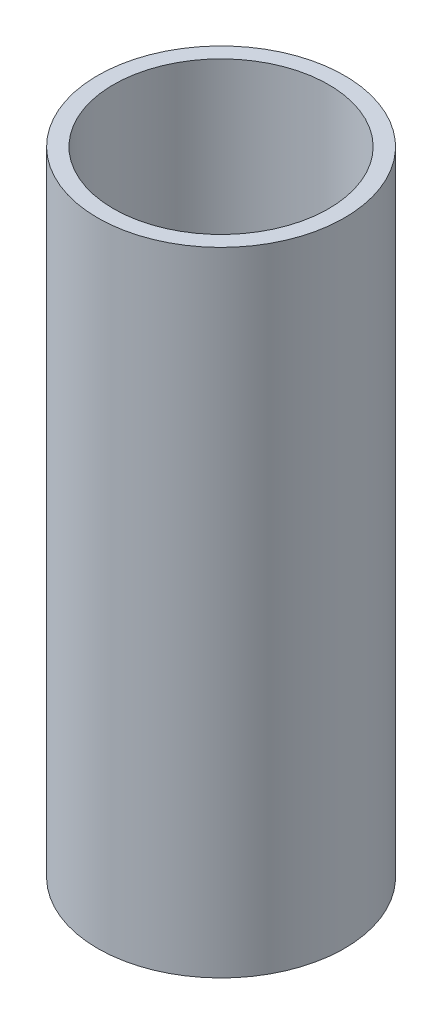
ISO-10303-21;
HEADER;
FILE_DESCRIPTION(('STEP AP214'),'2;1');
FILE_NAME('part.step','',(''),(''),'','','');
FILE_SCHEMA(('AUTOMOTIVE_DESIGN { 1 0 10303 214 1 1 1 1 }'));
ENDSEC;
DATA;
#1=APPLICATION_CONTEXT('core data for automotive mechanical design processes');
#2=APPLICATION_PROTOCOL_DEFINITION('international standard','automotive_design',2000,#1);
#3=PRODUCT_CONTEXT('',#1,'mechanical');
#4=PRODUCT('Part','Part','',(#3));
#5=PRODUCT_RELATED_PRODUCT_CATEGORY('part','',(#4));
#6=PRODUCT_DEFINITION_FORMATION('','',#4);
#7=PRODUCT_DEFINITION_CONTEXT('part definition',#1,'design');
#8=PRODUCT_DEFINITION('design','',#6,#7);
#9=PRODUCT_DEFINITION_SHAPE('','',#8);
#10=(LENGTH_UNIT() NAMED_UNIT(*) SI_UNIT(.MILLI.,.METRE.));
#11=(NAMED_UNIT(*) PLANE_ANGLE_UNIT() SI_UNIT($,.RADIAN.));
#12=(NAMED_UNIT(*) SI_UNIT($,.STERADIAN.) SOLID_ANGLE_UNIT());
#13=UNCERTAINTY_MEASURE_WITH_UNIT(LENGTH_MEASURE(1.E-05),#10,'distance_accuracy_value','');
#14=(GEOMETRIC_REPRESENTATION_CONTEXT(3) GLOBAL_UNCERTAINTY_ASSIGNED_CONTEXT((#13)) GLOBAL_UNIT_ASSIGNED_CONTEXT((#10,
#11,#12)) REPRESENTATION_CONTEXT('',''));
#15=CARTESIAN_POINT('',(0.,0.,0.));
#16=DIRECTION('',(0.,0.,1.));
#17=DIRECTION('',(1.,0.,0.));
#18=AXIS2_PLACEMENT_3D('',#15,#16,#17);
#19=CARTESIAN_POINT('',(0.,30.,0.));
#20=DIRECTION('',(0.,1.,0.));
#21=DIRECTION('',(0.,0.,1.));
#22=AXIS2_PLACEMENT_3D('',#19,#20,#21);
#23=PLANE('',#22);
#24=CARTESIAN_POINT('',(0.,30.,0.));
#25=DIRECTION('',(0.,1.,0.));
#26=DIRECTION('',(0.,0.,1.));
#27=AXIS2_PLACEMENT_3D('',#24,#25,#26);
#28=CIRCLE('',#27,5.85);
#29=CARTESIAN_POINT('',(0.,30.,5.85));
#30=VERTEX_POINT('',#29);
#31=EDGE_CURVE('E10',#30,#30,#28,.T.);
#32=ORIENTED_EDGE('',*,*,#31,.T.);
#33=EDGE_LOOP('',(#32));
#34=FACE_BOUND('',#33,.T.);
#35=CARTESIAN_POINT('',(0.,30.,0.));
#36=DIRECTION('',(0.,1.,0.));
#37=DIRECTION('',(0.,0.,1.));
#38=AXIS2_PLACEMENT_3D('',#35,#36,#37);
#39=CIRCLE('',#38,5.1);
#40=CARTESIAN_POINT('',(0.,30.,5.1));
#41=VERTEX_POINT('',#40);
#42=EDGE_CURVE('E42',#41,#41,#39,.T.);
#43=ORIENTED_EDGE('',*,*,#42,.F.);
#44=EDGE_LOOP('',(#43));
#45=FACE_BOUND('',#44,.T.);
#46=ADVANCED_FACE('F31',(#34,#45),#23,.T.);
#47=CARTESIAN_POINT('',(0.,0.,0.));
#48=DIRECTION('',(0.,1.,0.));
#49=DIRECTION('',(0.,0.,1.));
#50=AXIS2_PLACEMENT_3D('',#47,#48,#49);
#51=PLANE('',#50);
#52=CARTESIAN_POINT('',(0.,0.,0.));
#53=DIRECTION('',(0.,1.,0.));
#54=DIRECTION('',(0.,0.,1.));
#55=AXIS2_PLACEMENT_3D('',#52,#53,#54);
#56=CIRCLE('',#55,5.85);
#57=CARTESIAN_POINT('',(0.,0.,5.85));
#58=VERTEX_POINT('',#57);
#59=EDGE_CURVE('E35',#58,#58,#56,.T.);
#60=ORIENTED_EDGE('',*,*,#59,.F.);
#61=EDGE_LOOP('',(#60));
#62=FACE_BOUND('',#61,.T.);
#63=CARTESIAN_POINT('',(0.,0.,0.));
#64=DIRECTION('',(0.,1.,0.));
#65=DIRECTION('',(0.,0.,1.));
#66=AXIS2_PLACEMENT_3D('',#63,#64,#65);
#67=CIRCLE('',#66,5.1);
#68=CARTESIAN_POINT('',(0.,0.,5.1));
#69=VERTEX_POINT('',#68);
#70=EDGE_CURVE('E44',#69,#69,#67,.T.);
#71=ORIENTED_EDGE('',*,*,#70,.T.);
#72=EDGE_LOOP('',(#71));
#73=FACE_BOUND('',#72,.T.);
#74=ADVANCED_FACE('F54',(#62,#73),#51,.F.);
#75=CARTESIAN_POINT('',(0.,30.,0.));
#76=DIRECTION('',(0.,-1.,0.));
#77=DIRECTION('',(0.,0.,-1.));
#78=AXIS2_PLACEMENT_3D('',#75,#76,#77);
#79=CYLINDRICAL_SURFACE('',#78,5.85);
#80=ORIENTED_EDGE('',*,*,#31,.F.);
#81=EDGE_LOOP('',(#80));
#82=FACE_BOUND('',#81,.T.);
#83=ORIENTED_EDGE('',*,*,#59,.T.);
#84=EDGE_LOOP('',(#83));
#85=FACE_BOUND('',#84,.T.);
#86=ADVANCED_FACE('F33',(#82,#85),#79,.T.);
#87=CARTESIAN_POINT('',(0.,30.,0.));
#88=DIRECTION('',(0.,-1.,0.));
#89=DIRECTION('',(0.,0.,-1.));
#90=AXIS2_PLACEMENT_3D('',#87,#88,#89);
#91=CYLINDRICAL_SURFACE('',#90,5.1);
#92=ORIENTED_EDGE('',*,*,#42,.T.);
#93=EDGE_LOOP('',(#92));
#94=FACE_BOUND('',#93,.T.);
#95=ORIENTED_EDGE('',*,*,#70,.F.);
#96=EDGE_LOOP('',(#95));
#97=FACE_BOUND('',#96,.T.);
#98=ADVANCED_FACE('F50',(#94,#97),#91,.F.);
#99=CLOSED_SHELL('',(#46,#74,#86,#98));
#100=MANIFOLD_SOLID_BREP('B2',#99);
#101=ADVANCED_BREP_SHAPE_REPRESENTATION('',(#18,#100),#14);
#102=SHAPE_DEFINITION_REPRESENTATION(#9,#101);
ENDSEC;
END-ISO-10303-21;
